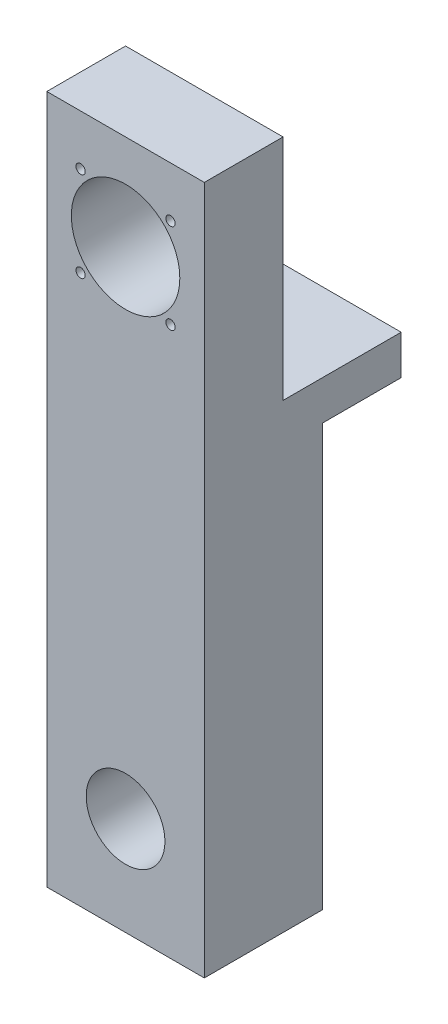
ISO-10303-21;
HEADER;
FILE_DESCRIPTION(('STEP AP214'),'2;1');
FILE_NAME('part.step','',(''),(''),'','','');
FILE_SCHEMA(('AUTOMOTIVE_DESIGN { 1 0 10303 214 1 1 1 1 }'));
ENDSEC;
DATA;
#1=APPLICATION_CONTEXT('core data for automotive mechanical design processes');
#2=APPLICATION_PROTOCOL_DEFINITION('international standard','automotive_design',2000,#1);
#3=PRODUCT_CONTEXT('',#1,'mechanical');
#4=PRODUCT('Part','Part','',(#3));
#5=PRODUCT_RELATED_PRODUCT_CATEGORY('part','',(#4));
#6=PRODUCT_DEFINITION_FORMATION('','',#4);
#7=PRODUCT_DEFINITION_CONTEXT('part definition',#1,'design');
#8=PRODUCT_DEFINITION('design','',#6,#7);
#9=PRODUCT_DEFINITION_SHAPE('','',#8);
#10=(LENGTH_UNIT() NAMED_UNIT(*) SI_UNIT(.MILLI.,.METRE.));
#11=(NAMED_UNIT(*) PLANE_ANGLE_UNIT() SI_UNIT($,.RADIAN.));
#12=(NAMED_UNIT(*) SI_UNIT($,.STERADIAN.) SOLID_ANGLE_UNIT());
#13=UNCERTAINTY_MEASURE_WITH_UNIT(LENGTH_MEASURE(1.E-05),#10,'distance_accuracy_value','');
#14=(GEOMETRIC_REPRESENTATION_CONTEXT(3) GLOBAL_UNCERTAINTY_ASSIGNED_CONTEXT((#13)) GLOBAL_UNIT_ASSIGNED_CONTEXT((#10,
#11,#12)) REPRESENTATION_CONTEXT('',''));
#15=CARTESIAN_POINT('',(0.,0.,0.));
#16=DIRECTION('',(0.,0.,1.));
#17=DIRECTION('',(1.,0.,0.));
#18=AXIS2_PLACEMENT_3D('',#15,#16,#17);
#19=CARTESIAN_POINT('',(25.4,222.25,19.05));
#20=DIRECTION('',(-1.,0.,0.));
#21=DIRECTION('',(0.,0.,1.));
#22=AXIS2_PLACEMENT_3D('',#19,#20,#21);
#23=PLANE('',#22);
#24=DIRECTION('',(0.,-1.,0.));
#25=VECTOR('',#24,1.);
#26=CARTESIAN_POINT('',(25.4,148.650670059,-44.45));
#27=LINE('',#26,#25);
#28=CARTESIAN_POINT('',(25.4,148.650670059,-44.45));
#29=VERTEX_POINT('',#28);
#30=CARTESIAN_POINT('',(25.4,135.950670059,-44.45));
#31=VERTEX_POINT('',#30);
#32=EDGE_CURVE('E99',#29,#31,#27,.T.);
#33=ORIENTED_EDGE('',*,*,#32,.F.);
#34=DIRECTION('',(0.,0.,1.));
#35=VECTOR('',#34,1.);
#36=CARTESIAN_POINT('',(25.4,148.650670059,-57.15));
#37=LINE('',#36,#35);
#38=CARTESIAN_POINT('',(25.4,148.650670059,-6.35));
#39=VERTEX_POINT('',#38);
#40=EDGE_CURVE('E210',#29,#39,#37,.T.);
#41=ORIENTED_EDGE('',*,*,#40,.T.);
#42=DIRECTION('',(0.,-1.,0.));
#43=VECTOR('',#42,1.);
#44=CARTESIAN_POINT('',(25.4,222.25,-6.35));
#45=LINE('',#44,#43);
#46=CARTESIAN_POINT('',(25.4,222.25,-6.35));
#47=VERTEX_POINT('',#46);
#48=EDGE_CURVE('E167',#47,#39,#45,.T.);
#49=ORIENTED_EDGE('',*,*,#48,.F.);
#50=DIRECTION('',(0.,0.,-1.));
#51=VECTOR('',#50,1.);
#52=CARTESIAN_POINT('',(25.4,222.25,19.05));
#53=LINE('',#52,#51);
#54=CARTESIAN_POINT('',(25.4,222.25,19.05));
#55=VERTEX_POINT('',#54);
#56=EDGE_CURVE('E127',#55,#47,#53,.T.);
#57=ORIENTED_EDGE('',*,*,#56,.F.);
#58=DIRECTION('',(0.,-1.,0.));
#59=VECTOR('',#58,1.);
#60=CARTESIAN_POINT('',(25.4,222.25,19.05));
#61=LINE('',#60,#59);
#62=CARTESIAN_POINT('',(25.4,0.,19.05));
#63=VERTEX_POINT('',#62);
#64=EDGE_CURVE('E135',#55,#63,#61,.T.);
#65=ORIENTED_EDGE('',*,*,#64,.T.);
#66=DIRECTION('',(0.,0.,-1.));
#67=VECTOR('',#66,1.);
#68=CARTESIAN_POINT('',(25.4,0.,19.05));
#69=LINE('',#68,#67);
#70=CARTESIAN_POINT('',(25.4,0.,-19.05));
#71=VERTEX_POINT('',#70);
#72=EDGE_CURVE('E124',#63,#71,#69,.T.);
#73=ORIENTED_EDGE('',*,*,#72,.T.);
#74=DIRECTION('',(0.,-1.,0.));
#75=VECTOR('',#74,1.);
#76=CARTESIAN_POINT('',(25.4,222.25,-19.05));
#77=LINE('',#76,#75);
#78=CARTESIAN_POINT('',(25.4,135.950670059,-19.05));
#79=VERTEX_POINT('',#78);
#80=EDGE_CURVE('E11',#79,#71,#77,.T.);
#81=ORIENTED_EDGE('',*,*,#80,.F.);
#82=DIRECTION('',(0.,0.,1.));
#83=VECTOR('',#82,1.);
#84=CARTESIAN_POINT('',(25.4,135.950670059,-57.15));
#85=LINE('',#84,#83);
#86=EDGE_CURVE('E58',#31,#79,#85,.T.);
#87=ORIENTED_EDGE('',*,*,#86,.F.);
#88=EDGE_LOOP('',(#33,#41,#49,#57,#65,#73,#81,#87));
#89=FACE_BOUND('',#88,.T.);
#90=ADVANCED_FACE('F35',(#89),#23,.F.);
#91=CARTESIAN_POINT('',(-25.4,222.25,19.05));
#92=DIRECTION('',(1.,0.,0.));
#93=DIRECTION('',(0.,0.,-1.));
#94=AXIS2_PLACEMENT_3D('',#91,#92,#93);
#95=PLANE('',#94);
#96=DIRECTION('',(0.,1.,0.));
#97=VECTOR('',#96,1.);
#98=CARTESIAN_POINT('',(-25.4,148.650670059,-44.45));
#99=LINE('',#98,#97);
#100=CARTESIAN_POINT('',(-25.4,135.950670059,-44.45));
#101=VERTEX_POINT('',#100);
#102=CARTESIAN_POINT('',(-25.4,148.650670059,-44.45));
#103=VERTEX_POINT('',#102);
#104=EDGE_CURVE('E50',#101,#103,#99,.T.);
#105=ORIENTED_EDGE('',*,*,#104,.F.);
#106=DIRECTION('',(0.,0.,1.));
#107=VECTOR('',#106,1.);
#108=CARTESIAN_POINT('',(-25.4,135.950670059,-57.15));
#109=LINE('',#108,#107);
#110=CARTESIAN_POINT('',(-25.4,135.950670059,-19.05));
#111=VERTEX_POINT('',#110);
#112=EDGE_CURVE('E108',#101,#111,#109,.T.);
#113=ORIENTED_EDGE('',*,*,#112,.T.);
#114=DIRECTION('',(0.,-1.,0.));
#115=VECTOR('',#114,1.);
#116=CARTESIAN_POINT('',(-25.4,222.25,-19.05));
#117=LINE('',#116,#115);
#118=CARTESIAN_POINT('',(-25.4,0.,-19.05));
#119=VERTEX_POINT('',#118);
#120=EDGE_CURVE('E43',#111,#119,#117,.T.);
#121=ORIENTED_EDGE('',*,*,#120,.T.);
#122=DIRECTION('',(0.,0.,1.));
#123=VECTOR('',#122,1.);
#124=CARTESIAN_POINT('',(-25.4,0.,19.05));
#125=LINE('',#124,#123);
#126=CARTESIAN_POINT('',(-25.4,0.,19.05));
#127=VERTEX_POINT('',#126);
#128=EDGE_CURVE('E140',#119,#127,#125,.T.);
#129=ORIENTED_EDGE('',*,*,#128,.T.);
#130=DIRECTION('',(0.,-1.,0.));
#131=VECTOR('',#130,1.);
#132=CARTESIAN_POINT('',(-25.4,222.25,19.05));
#133=LINE('',#132,#131);
#134=CARTESIAN_POINT('',(-25.4,222.25,19.05));
#135=VERTEX_POINT('',#134);
#136=EDGE_CURVE('E145',#135,#127,#133,.T.);
#137=ORIENTED_EDGE('',*,*,#136,.F.);
#138=DIRECTION('',(0.,0.,1.));
#139=VECTOR('',#138,1.);
#140=CARTESIAN_POINT('',(-25.4,222.25,19.05));
#141=LINE('',#140,#139);
#142=CARTESIAN_POINT('',(-25.4,222.25,-6.35));
#143=VERTEX_POINT('',#142);
#144=EDGE_CURVE('E130',#143,#135,#141,.T.);
#145=ORIENTED_EDGE('',*,*,#144,.F.);
#146=DIRECTION('',(0.,1.,0.));
#147=VECTOR('',#146,1.);
#148=CARTESIAN_POINT('',(-25.4,222.25,-6.35));
#149=LINE('',#148,#147);
#150=CARTESIAN_POINT('',(-25.4,148.650670059,-6.35));
#151=VERTEX_POINT('',#150);
#152=EDGE_CURVE('E175',#151,#143,#149,.T.);
#153=ORIENTED_EDGE('',*,*,#152,.F.);
#154=DIRECTION('',(0.,0.,1.));
#155=VECTOR('',#154,1.);
#156=CARTESIAN_POINT('',(-25.4,148.650670059,-57.15));
#157=LINE('',#156,#155);
#158=EDGE_CURVE('E117',#103,#151,#157,.T.);
#159=ORIENTED_EDGE('',*,*,#158,.F.);
#160=EDGE_LOOP('',(#105,#113,#121,#129,#137,#145,#153,#159));
#161=FACE_BOUND('',#160,.T.);
#162=ADVANCED_FACE('F150',(#161),#95,.F.);
#163=CARTESIAN_POINT('',(25.4,135.950670059,-57.15));
#164=DIRECTION('',(0.,1.,0.));
#165=DIRECTION('',(0.,0.,1.));
#166=AXIS2_PLACEMENT_3D('',#163,#164,#165);
#167=PLANE('',#166);
#168=DIRECTION('',(-1.,0.,0.));
#169=VECTOR('',#168,1.);
#170=CARTESIAN_POINT('',(25.4,135.950670059,-44.45));
#171=LINE('',#170,#169);
#172=EDGE_CURVE('E101',#31,#101,#171,.T.);
#173=ORIENTED_EDGE('',*,*,#172,.F.);
#174=ORIENTED_EDGE('',*,*,#86,.T.);
#175=DIRECTION('',(-1.,0.,0.));
#176=VECTOR('',#175,1.);
#177=CARTESIAN_POINT('',(25.4,135.950670059,-19.05));
#178=LINE('',#177,#176);
#179=EDGE_CURVE('E208',#79,#111,#178,.T.);
#180=ORIENTED_EDGE('',*,*,#179,.T.);
#181=ORIENTED_EDGE('',*,*,#112,.F.);
#182=EDGE_LOOP('',(#173,#174,#180,#181));
#183=FACE_BOUND('',#182,.T.);
#184=ADVANCED_FACE('F107',(#183),#167,.F.);
#185=CARTESIAN_POINT('',(25.4,148.650670059,-57.15));
#186=DIRECTION('',(0.,-1.,0.));
#187=DIRECTION('',(0.,0.,-1.));
#188=AXIS2_PLACEMENT_3D('',#185,#186,#187);
#189=PLANE('',#188);
#190=DIRECTION('',(1.,0.,0.));
#191=VECTOR('',#190,1.);
#192=CARTESIAN_POINT('',(25.4,148.650670059,-44.45));
#193=LINE('',#192,#191);
#194=EDGE_CURVE('E102',#103,#29,#193,.T.);
#195=ORIENTED_EDGE('',*,*,#194,.F.);
#196=ORIENTED_EDGE('',*,*,#158,.T.);
#197=DIRECTION('',(-1.,0.,0.));
#198=VECTOR('',#197,1.);
#199=CARTESIAN_POINT('',(25.4,148.650670059,-6.35));
#200=LINE('',#199,#198);
#201=EDGE_CURVE('E178',#39,#151,#200,.T.);
#202=ORIENTED_EDGE('',*,*,#201,.F.);
#203=ORIENTED_EDGE('',*,*,#40,.F.);
#204=EDGE_LOOP('',(#195,#196,#202,#203));
#205=FACE_BOUND('',#204,.T.);
#206=ADVANCED_FACE('F213',(#205),#189,.F.);
#207=CARTESIAN_POINT('',(0.,222.25,0.));
#208=DIRECTION('',(0.,-1.,0.));
#209=DIRECTION('',(0.,0.,-1.));
#210=AXIS2_PLACEMENT_3D('',#207,#208,#209);
#211=PLANE('',#210);
#212=DIRECTION('',(1.,0.,0.));
#213=VECTOR('',#212,1.);
#214=CARTESIAN_POINT('',(25.4,222.25,-6.35));
#215=LINE('',#214,#213);
#216=EDGE_CURVE('E171',#143,#47,#215,.T.);
#217=ORIENTED_EDGE('',*,*,#216,.F.);
#218=ORIENTED_EDGE('',*,*,#144,.T.);
#219=DIRECTION('',(1.,0.,0.));
#220=VECTOR('',#219,1.);
#221=CARTESIAN_POINT('',(-25.4,222.25,19.05));
#222=LINE('',#221,#220);
#223=EDGE_CURVE('E133',#135,#55,#222,.T.);
#224=ORIENTED_EDGE('',*,*,#223,.T.);
#225=ORIENTED_EDGE('',*,*,#56,.T.);
#226=EDGE_LOOP('',(#217,#218,#224,#225));
#227=FACE_BOUND('',#226,.T.);
#228=ADVANCED_FACE('F170',(#227),#211,.F.);
#229=CARTESIAN_POINT('',(0.,191.550000059,-19.05));
#230=DIRECTION('',(0.,0.,1.));
#231=DIRECTION('',(1.,0.,0.));
#232=AXIS2_PLACEMENT_3D('',#229,#230,#231);
#233=CYLINDRICAL_SURFACE('',#232,17.500000052);
#234=CARTESIAN_POINT('',(0.,191.550000059,19.05));
#235=DIRECTION('',(0.,0.,1.));
#236=DIRECTION('',(1.,0.,0.));
#237=AXIS2_PLACEMENT_3D('',#234,#235,#236);
#238=CIRCLE('',#237,17.500000052);
#239=CARTESIAN_POINT('',(17.500000052,191.550000059,19.05));
#240=VERTEX_POINT('',#239);
#241=EDGE_CURVE('E112',#240,#240,#238,.T.);
#242=CARTESIAN_POINT('',(0.,191.550000059,-6.35));
#243=DIRECTION('',(0.,0.,-1.));
#244=DIRECTION('',(-1.,0.,0.));
#245=AXIS2_PLACEMENT_3D('',#242,#243,#244);
#246=CIRCLE('',#245,17.500000052);
#247=CARTESIAN_POINT('',(17.500000052,191.550000059,-6.35));
#248=VERTEX_POINT('',#247);
#249=EDGE_CURVE('E193',#248,#248,#246,.F.);
#250=CARTESIAN_POINT('',(17.500000052,191.550000059,19.05));
#251=CARTESIAN_POINT('',(17.500000052,191.550000059,18.7854166666667));
#252=CARTESIAN_POINT('',(17.500000052,191.550000059,18.5208333333333));
#253=CARTESIAN_POINT('',(17.500000052,191.550000059,17.9916666666667));
#254=CARTESIAN_POINT('',(17.500000052,191.550000059,17.7270833333333));
#255=CARTESIAN_POINT('',(17.500000052,191.550000059,17.1979166666667));
#256=CARTESIAN_POINT('',(17.500000052,191.550000059,16.9333333333333));
#257=CARTESIAN_POINT('',(17.500000052,191.550000059,16.4041666666667));
#258=CARTESIAN_POINT('',(17.500000052,191.550000059,16.1395833333333));
#259=CARTESIAN_POINT('',(17.500000052,191.550000059,15.6104166666667));
#260=CARTESIAN_POINT('',(17.500000052,191.550000059,15.3458333333333));
#261=CARTESIAN_POINT('',(17.500000052,191.550000059,14.8166666666667));
#262=CARTESIAN_POINT('',(17.500000052,191.550000059,14.5520833333333));
#263=CARTESIAN_POINT('',(17.500000052,191.550000059,14.0229166666667));
#264=CARTESIAN_POINT('',(17.500000052,191.550000059,13.7583333333333));
#265=CARTESIAN_POINT('',(17.500000052,191.550000059,13.2291666666667));
#266=CARTESIAN_POINT('',(17.500000052,191.550000059,12.9645833333333));
#267=CARTESIAN_POINT('',(17.500000052,191.550000059,12.4354166666667));
#268=CARTESIAN_POINT('',(17.500000052,191.550000059,12.1708333333333));
#269=CARTESIAN_POINT('',(17.500000052,191.550000059,11.6416666666667));
#270=CARTESIAN_POINT('',(17.500000052,191.550000059,11.3770833333333));
#271=CARTESIAN_POINT('',(17.500000052,191.550000059,10.8479166666667));
#272=CARTESIAN_POINT('',(17.500000052,191.550000059,10.5833333333333));
#273=CARTESIAN_POINT('',(17.500000052,191.550000059,10.0541666666667));
#274=CARTESIAN_POINT('',(17.500000052,191.550000059,9.78958333333334));
#275=CARTESIAN_POINT('',(17.500000052,191.550000059,9.26041666666667));
#276=CARTESIAN_POINT('',(17.500000052,191.550000059,8.99583333333334));
#277=CARTESIAN_POINT('',(17.500000052,191.550000059,8.46666666666667));
#278=CARTESIAN_POINT('',(17.500000052,191.550000059,8.20208333333334));
#279=CARTESIAN_POINT('',(17.500000052,191.550000059,7.67291666666667));
#280=CARTESIAN_POINT('',(17.500000052,191.550000059,7.40833333333334));
#281=CARTESIAN_POINT('',(17.500000052,191.550000059,6.87916666666667));
#282=CARTESIAN_POINT('',(17.500000052,191.550000059,6.61458333333334));
#283=CARTESIAN_POINT('',(17.500000052,191.550000059,6.08541666666667));
#284=CARTESIAN_POINT('',(17.500000052,191.550000059,5.82083333333334));
#285=CARTESIAN_POINT('',(17.500000052,191.550000059,5.29166666666667));
#286=CARTESIAN_POINT('',(17.500000052,191.550000059,5.02708333333334));
#287=CARTESIAN_POINT('',(17.500000052,191.550000059,4.49791666666667));
#288=CARTESIAN_POINT('',(17.500000052,191.550000059,4.23333333333334));
#289=CARTESIAN_POINT('',(17.500000052,191.550000059,3.70416666666667));
#290=CARTESIAN_POINT('',(17.500000052,191.550000059,3.43958333333334));
#291=CARTESIAN_POINT('',(17.500000052,191.550000059,2.91041666666667));
#292=CARTESIAN_POINT('',(17.500000052,191.550000059,2.64583333333334));
#293=CARTESIAN_POINT('',(17.500000052,191.550000059,2.11666666666667));
#294=CARTESIAN_POINT('',(17.500000052,191.550000059,1.85208333333334));
#295=CARTESIAN_POINT('',(17.500000052,191.550000059,1.32291666666667));
#296=CARTESIAN_POINT('',(17.500000052,191.550000059,1.05833333333334));
#297=CARTESIAN_POINT('',(17.500000052,191.550000059,0.52916666666667));
#298=CARTESIAN_POINT('',(17.500000052,191.550000059,0.264583333333337));
#299=CARTESIAN_POINT('',(17.500000052,191.550000059,-0.26458333333333));
#300=CARTESIAN_POINT('',(17.500000052,191.550000059,-0.529166666666663));
#301=CARTESIAN_POINT('',(17.500000052,191.550000059,-1.05833333333333));
#302=CARTESIAN_POINT('',(17.500000052,191.550000059,-1.32291666666666));
#303=CARTESIAN_POINT('',(17.500000052,191.550000059,-1.85208333333333));
#304=CARTESIAN_POINT('',(17.500000052,191.550000059,-2.11666666666666));
#305=CARTESIAN_POINT('',(17.500000052,191.550000059,-2.64583333333333));
#306=CARTESIAN_POINT('',(17.500000052,191.550000059,-2.91041666666666));
#307=CARTESIAN_POINT('',(17.500000052,191.550000059,-3.43958333333333));
#308=CARTESIAN_POINT('',(17.500000052,191.550000059,-3.70416666666666));
#309=CARTESIAN_POINT('',(17.500000052,191.550000059,-4.23333333333333));
#310=CARTESIAN_POINT('',(17.500000052,191.550000059,-4.49791666666666));
#311=CARTESIAN_POINT('',(17.500000052,191.550000059,-5.02708333333333));
#312=CARTESIAN_POINT('',(17.500000052,191.550000059,-5.29166666666666));
#313=CARTESIAN_POINT('',(17.500000052,191.550000059,-5.82083333333333));
#314=CARTESIAN_POINT('',(17.500000052,191.550000059,-6.08541666666666));
#315=CARTESIAN_POINT('',(17.500000052,191.550000059,-6.35));
#316=B_SPLINE_CURVE_WITH_KNOTS('',3,(#250,#251,#252,#253,#254,#255,#256,#257,#258,#259,#260,
#261,#262,#263,#264,#265,#266,#267,#268,#269,#270,#271,#272,#273,#274,#275,#276,#277,#278,#279,
#280,#281,#282,#283,#284,#285,#286,#287,#288,#289,#290,#291,#292,#293,#294,#295,#296,#297,#298,
#299,#300,#301,#302,#303,#304,#305,#306,#307,#308,#309,#310,#311,#312,#313,#314,#315),
.UNSPECIFIED.,.F.,.F.,(4,2,2,2,2,2,2,2,2,2,2,2,2,2,2,2,2,2,2,2,2,2,2,2,2,2,2,2,2,2,2,2,4),(0.,
0.793750000000003,1.5875,2.38125,3.175,3.96875,4.7625,5.55625,6.35,7.14375,7.9375,8.73125,9.525,
10.31875,11.1125,11.90625,12.7,13.49375,14.2875,15.08125,15.875,16.66875,17.4625,18.25625,19.05,
19.84375,20.6375,21.43125,22.225,23.01875,23.8125,24.60625,25.4),.UNSPECIFIED.);
#317=EDGE_CURVE('BSEAM232',#240,#248,#316,.T.);
#318=ORIENTED_EDGE('',*,*,#241,.T.);
#319=ORIENTED_EDGE('',*,*,#249,.F.);
#320=ORIENTED_EDGE('',*,*,#317,.T.);
#321=ORIENTED_EDGE('',*,*,#317,.F.);
#322=EDGE_LOOP('',(#318,#320,#319,#321));
#323=FACE_BOUND('',#322,.T.);
#324=ADVANCED_FACE('F232',(#323),#233,.F.);
#325=CARTESIAN_POINT('',(-14.5034,206.053400059,19.05));
#326=DIRECTION('',(0.,0.,-1.));
#327=DIRECTION('',(-1.,0.,0.));
#328=AXIS2_PLACEMENT_3D('',#325,#326,#327);
#329=CYLINDRICAL_SURFACE('',#328,1.500000048);
#330=CARTESIAN_POINT('',(-14.5034,206.053400059,19.05));
#331=DIRECTION('',(0.,0.,-1.));
#332=DIRECTION('',(-1.,0.,0.));
#333=AXIS2_PLACEMENT_3D('',#330,#331,#332);
#334=CIRCLE('',#333,1.500000048);
#335=CARTESIAN_POINT('',(-16.003400048,206.053400059,19.05));
#336=VERTEX_POINT('',#335);
#337=EDGE_CURVE('E200',#336,#336,#334,.T.);
#338=CARTESIAN_POINT('',(-14.5034,206.053400059,-6.35));
#339=DIRECTION('',(0.,0.,-1.));
#340=DIRECTION('',(-1.,0.,0.));
#341=AXIS2_PLACEMENT_3D('',#338,#339,#340);
#342=CIRCLE('',#341,1.500000048);
#343=CARTESIAN_POINT('',(-16.003400048,206.053400059,-6.35));
#344=VERTEX_POINT('',#343);
#345=EDGE_CURVE('E190',#344,#344,#342,.F.);
#346=CARTESIAN_POINT('',(-16.003400048,206.053400059,19.05));
#347=CARTESIAN_POINT('',(-16.003400048,206.053400059,18.7854166666667));
#348=CARTESIAN_POINT('',(-16.003400048,206.053400059,18.5208333333333));
#349=CARTESIAN_POINT('',(-16.003400048,206.053400059,17.9916666666667));
#350=CARTESIAN_POINT('',(-16.003400048,206.053400059,17.7270833333333));
#351=CARTESIAN_POINT('',(-16.003400048,206.053400059,17.1979166666667));
#352=CARTESIAN_POINT('',(-16.003400048,206.053400059,16.9333333333333));
#353=CARTESIAN_POINT('',(-16.003400048,206.053400059,16.4041666666667));
#354=CARTESIAN_POINT('',(-16.003400048,206.053400059,16.1395833333333));
#355=CARTESIAN_POINT('',(-16.003400048,206.053400059,15.6104166666667));
#356=CARTESIAN_POINT('',(-16.003400048,206.053400059,15.3458333333333));
#357=CARTESIAN_POINT('',(-16.003400048,206.053400059,14.8166666666667));
#358=CARTESIAN_POINT('',(-16.003400048,206.053400059,14.5520833333333));
#359=CARTESIAN_POINT('',(-16.003400048,206.053400059,14.0229166666667));
#360=CARTESIAN_POINT('',(-16.003400048,206.053400059,13.7583333333333));
#361=CARTESIAN_POINT('',(-16.003400048,206.053400059,13.2291666666667));
#362=CARTESIAN_POINT('',(-16.003400048,206.053400059,12.9645833333333));
#363=CARTESIAN_POINT('',(-16.003400048,206.053400059,12.4354166666667));
#364=CARTESIAN_POINT('',(-16.003400048,206.053400059,12.1708333333333));
#365=CARTESIAN_POINT('',(-16.003400048,206.053400059,11.6416666666667));
#366=CARTESIAN_POINT('',(-16.003400048,206.053400059,11.3770833333333));
#367=CARTESIAN_POINT('',(-16.003400048,206.053400059,10.8479166666667));
#368=CARTESIAN_POINT('',(-16.003400048,206.053400059,10.5833333333333));
#369=CARTESIAN_POINT('',(-16.003400048,206.053400059,10.0541666666667));
#370=CARTESIAN_POINT('',(-16.003400048,206.053400059,9.78958333333334));
#371=CARTESIAN_POINT('',(-16.003400048,206.053400059,9.26041666666667));
#372=CARTESIAN_POINT('',(-16.003400048,206.053400059,8.99583333333334));
#373=CARTESIAN_POINT('',(-16.003400048,206.053400059,8.46666666666667));
#374=CARTESIAN_POINT('',(-16.003400048,206.053400059,8.20208333333334));
#375=CARTESIAN_POINT('',(-16.003400048,206.053400059,7.67291666666667));
#376=CARTESIAN_POINT('',(-16.003400048,206.053400059,7.40833333333334));
#377=CARTESIAN_POINT('',(-16.003400048,206.053400059,6.87916666666667));
#378=CARTESIAN_POINT('',(-16.003400048,206.053400059,6.61458333333334));
#379=CARTESIAN_POINT('',(-16.003400048,206.053400059,6.08541666666667));
#380=CARTESIAN_POINT('',(-16.003400048,206.053400059,5.82083333333334));
#381=CARTESIAN_POINT('',(-16.003400048,206.053400059,5.29166666666667));
#382=CARTESIAN_POINT('',(-16.003400048,206.053400059,5.02708333333334));
#383=CARTESIAN_POINT('',(-16.003400048,206.053400059,4.49791666666667));
#384=CARTESIAN_POINT('',(-16.003400048,206.053400059,4.23333333333334));
#385=CARTESIAN_POINT('',(-16.003400048,206.053400059,3.70416666666667));
#386=CARTESIAN_POINT('',(-16.003400048,206.053400059,3.43958333333334));
#387=CARTESIAN_POINT('',(-16.003400048,206.053400059,2.91041666666667));
#388=CARTESIAN_POINT('',(-16.003400048,206.053400059,2.64583333333334));
#389=CARTESIAN_POINT('',(-16.003400048,206.053400059,2.11666666666667));
#390=CARTESIAN_POINT('',(-16.003400048,206.053400059,1.85208333333334));
#391=CARTESIAN_POINT('',(-16.003400048,206.053400059,1.32291666666667));
#392=CARTESIAN_POINT('',(-16.003400048,206.053400059,1.05833333333334));
#393=CARTESIAN_POINT('',(-16.003400048,206.053400059,0.52916666666667));
#394=CARTESIAN_POINT('',(-16.003400048,206.053400059,0.264583333333337));
#395=CARTESIAN_POINT('',(-16.003400048,206.053400059,-0.26458333333333));
#396=CARTESIAN_POINT('',(-16.003400048,206.053400059,-0.529166666666663));
#397=CARTESIAN_POINT('',(-16.003400048,206.053400059,-1.05833333333333));
#398=CARTESIAN_POINT('',(-16.003400048,206.053400059,-1.32291666666666));
#399=CARTESIAN_POINT('',(-16.003400048,206.053400059,-1.85208333333333));
#400=CARTESIAN_POINT('',(-16.003400048,206.053400059,-2.11666666666666));
#401=CARTESIAN_POINT('',(-16.003400048,206.053400059,-2.64583333333333));
#402=CARTESIAN_POINT('',(-16.003400048,206.053400059,-2.91041666666666));
#403=CARTESIAN_POINT('',(-16.003400048,206.053400059,-3.43958333333333));
#404=CARTESIAN_POINT('',(-16.003400048,206.053400059,-3.70416666666666));
#405=CARTESIAN_POINT('',(-16.003400048,206.053400059,-4.23333333333333));
#406=CARTESIAN_POINT('',(-16.003400048,206.053400059,-4.49791666666667));
#407=CARTESIAN_POINT('',(-16.003400048,206.053400059,-5.02708333333333));
#408=CARTESIAN_POINT('',(-16.003400048,206.053400059,-5.29166666666667));
#409=CARTESIAN_POINT('',(-16.003400048,206.053400059,-5.82083333333333));
#410=CARTESIAN_POINT('',(-16.003400048,206.053400059,-6.08541666666667));
#411=CARTESIAN_POINT('',(-16.003400048,206.053400059,-6.35));
#412=B_SPLINE_CURVE_WITH_KNOTS('',3,(#346,#347,#348,#349,#350,#351,#352,#353,#354,#355,#356,
#357,#358,#359,#360,#361,#362,#363,#364,#365,#366,#367,#368,#369,#370,#371,#372,#373,#374,#375,
#376,#377,#378,#379,#380,#381,#382,#383,#384,#385,#386,#387,#388,#389,#390,#391,#392,#393,#394,
#395,#396,#397,#398,#399,#400,#401,#402,#403,#404,#405,#406,#407,#408,#409,#410,#411),
.UNSPECIFIED.,.F.,.F.,(4,2,2,2,2,2,2,2,2,2,2,2,2,2,2,2,2,2,2,2,2,2,2,2,2,2,2,2,2,2,2,2,4),(0.,
0.793749999999999,1.5875,2.38125,3.175,3.96875,4.7625,5.55625,6.35,7.14375,7.9375,8.73125,9.525,
10.31875,11.1125,11.90625,12.7,13.49375,14.2875,15.08125,15.875,16.66875,17.4625,18.25625,19.05,
19.84375,20.6375,21.43125,22.225,23.01875,23.8125,24.60625,25.4),.UNSPECIFIED.);
#413=EDGE_CURVE('BSEAM234',#336,#344,#412,.T.);
#414=ORIENTED_EDGE('',*,*,#337,.F.);
#415=ORIENTED_EDGE('',*,*,#345,.F.);
#416=ORIENTED_EDGE('',*,*,#413,.T.);
#417=ORIENTED_EDGE('',*,*,#413,.F.);
#418=EDGE_LOOP('',(#414,#416,#415,#417));
#419=FACE_BOUND('',#418,.T.);
#420=ADVANCED_FACE('F234',(#419),#329,.F.);
#421=CARTESIAN_POINT('',(14.5034,206.053400059,19.05));
#422=DIRECTION('',(0.,0.,-1.));
#423=DIRECTION('',(-1.,0.,0.));
#424=AXIS2_PLACEMENT_3D('',#421,#422,#423);
#425=CYLINDRICAL_SURFACE('',#424,1.500000048);
#426=CARTESIAN_POINT('',(14.5034,206.053400059,19.05));
#427=DIRECTION('',(0.,0.,-1.));
#428=DIRECTION('',(-1.,0.,0.));
#429=AXIS2_PLACEMENT_3D('',#426,#427,#428);
#430=CIRCLE('',#429,1.500000048);
#431=CARTESIAN_POINT('',(13.003399952,206.053400059,19.05));
#432=VERTEX_POINT('',#431);
#433=EDGE_CURVE('E197',#432,#432,#430,.T.);
#434=CARTESIAN_POINT('',(14.5034,206.053400059,-6.35));
#435=DIRECTION('',(0.,0.,-1.));
#436=DIRECTION('',(-1.,0.,0.));
#437=AXIS2_PLACEMENT_3D('',#434,#435,#436);
#438=CIRCLE('',#437,1.500000048);
#439=CARTESIAN_POINT('',(13.003399952,206.053400059,-6.35));
#440=VERTEX_POINT('',#439);
#441=EDGE_CURVE('E187',#440,#440,#438,.F.);
#442=CARTESIAN_POINT('',(13.003399952,206.053400059,19.05));
#443=CARTESIAN_POINT('',(13.003399952,206.053400059,18.7854166666667));
#444=CARTESIAN_POINT('',(13.003399952,206.053400059,18.5208333333333));
#445=CARTESIAN_POINT('',(13.003399952,206.053400059,17.9916666666667));
#446=CARTESIAN_POINT('',(13.003399952,206.053400059,17.7270833333333));
#447=CARTESIAN_POINT('',(13.003399952,206.053400059,17.1979166666667));
#448=CARTESIAN_POINT('',(13.003399952,206.053400059,16.9333333333333));
#449=CARTESIAN_POINT('',(13.003399952,206.053400059,16.4041666666667));
#450=CARTESIAN_POINT('',(13.003399952,206.053400059,16.1395833333333));
#451=CARTESIAN_POINT('',(13.003399952,206.053400059,15.6104166666667));
#452=CARTESIAN_POINT('',(13.003399952,206.053400059,15.3458333333333));
#453=CARTESIAN_POINT('',(13.003399952,206.053400059,14.8166666666667));
#454=CARTESIAN_POINT('',(13.003399952,206.053400059,14.5520833333333));
#455=CARTESIAN_POINT('',(13.003399952,206.053400059,14.0229166666667));
#456=CARTESIAN_POINT('',(13.003399952,206.053400059,13.7583333333333));
#457=CARTESIAN_POINT('',(13.003399952,206.053400059,13.2291666666667));
#458=CARTESIAN_POINT('',(13.003399952,206.053400059,12.9645833333333));
#459=CARTESIAN_POINT('',(13.003399952,206.053400059,12.4354166666667));
#460=CARTESIAN_POINT('',(13.003399952,206.053400059,12.1708333333333));
#461=CARTESIAN_POINT('',(13.003399952,206.053400059,11.6416666666667));
#462=CARTESIAN_POINT('',(13.003399952,206.053400059,11.3770833333333));
#463=CARTESIAN_POINT('',(13.003399952,206.053400059,10.8479166666667));
#464=CARTESIAN_POINT('',(13.003399952,206.053400059,10.5833333333333));
#465=CARTESIAN_POINT('',(13.003399952,206.053400059,10.0541666666667));
#466=CARTESIAN_POINT('',(13.003399952,206.053400059,9.78958333333334));
#467=CARTESIAN_POINT('',(13.003399952,206.053400059,9.26041666666667));
#468=CARTESIAN_POINT('',(13.003399952,206.053400059,8.99583333333334));
#469=CARTESIAN_POINT('',(13.003399952,206.053400059,8.46666666666667));
#470=CARTESIAN_POINT('',(13.003399952,206.053400059,8.20208333333334));
#471=CARTESIAN_POINT('',(13.003399952,206.053400059,7.67291666666667));
#472=CARTESIAN_POINT('',(13.003399952,206.053400059,7.40833333333334));
#473=CARTESIAN_POINT('',(13.003399952,206.053400059,6.87916666666667));
#474=CARTESIAN_POINT('',(13.003399952,206.053400059,6.61458333333334));
#475=CARTESIAN_POINT('',(13.003399952,206.053400059,6.08541666666667));
#476=CARTESIAN_POINT('',(13.003399952,206.053400059,5.82083333333334));
#477=CARTESIAN_POINT('',(13.003399952,206.053400059,5.29166666666667));
#478=CARTESIAN_POINT('',(13.003399952,206.053400059,5.02708333333334));
#479=CARTESIAN_POINT('',(13.003399952,206.053400059,4.49791666666667));
#480=CARTESIAN_POINT('',(13.003399952,206.053400059,4.23333333333334));
#481=CARTESIAN_POINT('',(13.003399952,206.053400059,3.70416666666667));
#482=CARTESIAN_POINT('',(13.003399952,206.053400059,3.43958333333334));
#483=CARTESIAN_POINT('',(13.003399952,206.053400059,2.91041666666667));
#484=CARTESIAN_POINT('',(13.003399952,206.053400059,2.64583333333334));
#485=CARTESIAN_POINT('',(13.003399952,206.053400059,2.11666666666667));
#486=CARTESIAN_POINT('',(13.003399952,206.053400059,1.85208333333334));
#487=CARTESIAN_POINT('',(13.003399952,206.053400059,1.32291666666667));
#488=CARTESIAN_POINT('',(13.003399952,206.053400059,1.05833333333334));
#489=CARTESIAN_POINT('',(13.003399952,206.053400059,0.52916666666667));
#490=CARTESIAN_POINT('',(13.003399952,206.053400059,0.264583333333337));
#491=CARTESIAN_POINT('',(13.003399952,206.053400059,-0.26458333333333));
#492=CARTESIAN_POINT('',(13.003399952,206.053400059,-0.529166666666663));
#493=CARTESIAN_POINT('',(13.003399952,206.053400059,-1.05833333333333));
#494=CARTESIAN_POINT('',(13.003399952,206.053400059,-1.32291666666666));
#495=CARTESIAN_POINT('',(13.003399952,206.053400059,-1.85208333333333));
#496=CARTESIAN_POINT('',(13.003399952,206.053400059,-2.11666666666666));
#497=CARTESIAN_POINT('',(13.003399952,206.053400059,-2.64583333333333));
#498=CARTESIAN_POINT('',(13.003399952,206.053400059,-2.91041666666666));
#499=CARTESIAN_POINT('',(13.003399952,206.053400059,-3.43958333333333));
#500=CARTESIAN_POINT('',(13.003399952,206.053400059,-3.70416666666666));
#501=CARTESIAN_POINT('',(13.003399952,206.053400059,-4.23333333333333));
#502=CARTESIAN_POINT('',(13.003399952,206.053400059,-4.49791666666667));
#503=CARTESIAN_POINT('',(13.003399952,206.053400059,-5.02708333333333));
#504=CARTESIAN_POINT('',(13.003399952,206.053400059,-5.29166666666667));
#505=CARTESIAN_POINT('',(13.003399952,206.053400059,-5.82083333333333));
#506=CARTESIAN_POINT('',(13.003399952,206.053400059,-6.08541666666667));
#507=CARTESIAN_POINT('',(13.003399952,206.053400059,-6.35));
#508=B_SPLINE_CURVE_WITH_KNOTS('',3,(#442,#443,#444,#445,#446,#447,#448,#449,#450,#451,#452,
#453,#454,#455,#456,#457,#458,#459,#460,#461,#462,#463,#464,#465,#466,#467,#468,#469,#470,#471,
#472,#473,#474,#475,#476,#477,#478,#479,#480,#481,#482,#483,#484,#485,#486,#487,#488,#489,#490,
#491,#492,#493,#494,#495,#496,#497,#498,#499,#500,#501,#502,#503,#504,#505,#506,#507),
.UNSPECIFIED.,.F.,.F.,(4,2,2,2,2,2,2,2,2,2,2,2,2,2,2,2,2,2,2,2,2,2,2,2,2,2,2,2,2,2,2,2,4),(0.,
0.793749999999999,1.5875,2.38125,3.175,3.96875,4.7625,5.55625,6.35,7.14375,7.9375,8.73125,9.525,
10.31875,11.1125,11.90625,12.7,13.49375,14.2875,15.08125,15.875,16.66875,17.4625,18.25625,19.05,
19.84375,20.6375,21.43125,22.225,23.01875,23.8125,24.60625,25.4),.UNSPECIFIED.);
#509=EDGE_CURVE('BSEAM241',#432,#440,#508,.T.);
#510=ORIENTED_EDGE('',*,*,#433,.F.);
#511=ORIENTED_EDGE('',*,*,#441,.F.);
#512=ORIENTED_EDGE('',*,*,#509,.T.);
#513=ORIENTED_EDGE('',*,*,#509,.F.);
#514=EDGE_LOOP('',(#510,#512,#511,#513));
#515=FACE_BOUND('',#514,.T.);
#516=ADVANCED_FACE('F241',(#515),#425,.F.);
#517=CARTESIAN_POINT('',(14.5034,177.046600059,19.05));
#518=DIRECTION('',(0.,0.,-1.));
#519=DIRECTION('',(-1.,0.,0.));
#520=AXIS2_PLACEMENT_3D('',#517,#518,#519);
#521=CYLINDRICAL_SURFACE('',#520,1.500000048);
#522=CARTESIAN_POINT('',(14.5034,177.046600059,19.05));
#523=DIRECTION('',(0.,0.,-1.));
#524=DIRECTION('',(-1.,0.,0.));
#525=AXIS2_PLACEMENT_3D('',#522,#523,#524);
#526=CIRCLE('',#525,1.500000048);
#527=CARTESIAN_POINT('',(13.003399952,177.046600059,19.05));
#528=VERTEX_POINT('',#527);
#529=EDGE_CURVE('E201',#528,#528,#526,.T.);
#530=CARTESIAN_POINT('',(14.5034,177.046600059,-6.35));
#531=DIRECTION('',(0.,0.,-1.));
#532=DIRECTION('',(-1.,0.,0.));
#533=AXIS2_PLACEMENT_3D('',#530,#531,#532);
#534=CIRCLE('',#533,1.500000048);
#535=CARTESIAN_POINT('',(13.003399952,177.046600059,-6.35));
#536=VERTEX_POINT('',#535);
#537=EDGE_CURVE('E184',#536,#536,#534,.F.);
#538=CARTESIAN_POINT('',(13.003399952,177.046600059,19.05));
#539=CARTESIAN_POINT('',(13.003399952,177.046600059,18.7854166666667));
#540=CARTESIAN_POINT('',(13.003399952,177.046600059,18.5208333333333));
#541=CARTESIAN_POINT('',(13.003399952,177.046600059,17.9916666666667));
#542=CARTESIAN_POINT('',(13.003399952,177.046600059,17.7270833333333));
#543=CARTESIAN_POINT('',(13.003399952,177.046600059,17.1979166666667));
#544=CARTESIAN_POINT('',(13.003399952,177.046600059,16.9333333333333));
#545=CARTESIAN_POINT('',(13.003399952,177.046600059,16.4041666666667));
#546=CARTESIAN_POINT('',(13.003399952,177.046600059,16.1395833333333));
#547=CARTESIAN_POINT('',(13.003399952,177.046600059,15.6104166666667));
#548=CARTESIAN_POINT('',(13.003399952,177.046600059,15.3458333333333));
#549=CARTESIAN_POINT('',(13.003399952,177.046600059,14.8166666666667));
#550=CARTESIAN_POINT('',(13.003399952,177.046600059,14.5520833333333));
#551=CARTESIAN_POINT('',(13.003399952,177.046600059,14.0229166666667));
#552=CARTESIAN_POINT('',(13.003399952,177.046600059,13.7583333333333));
#553=CARTESIAN_POINT('',(13.003399952,177.046600059,13.2291666666667));
#554=CARTESIAN_POINT('',(13.003399952,177.046600059,12.9645833333333));
#555=CARTESIAN_POINT('',(13.003399952,177.046600059,12.4354166666667));
#556=CARTESIAN_POINT('',(13.003399952,177.046600059,12.1708333333333));
#557=CARTESIAN_POINT('',(13.003399952,177.046600059,11.6416666666667));
#558=CARTESIAN_POINT('',(13.003399952,177.046600059,11.3770833333333));
#559=CARTESIAN_POINT('',(13.003399952,177.046600059,10.8479166666667));
#560=CARTESIAN_POINT('',(13.003399952,177.046600059,10.5833333333333));
#561=CARTESIAN_POINT('',(13.003399952,177.046600059,10.0541666666667));
#562=CARTESIAN_POINT('',(13.003399952,177.046600059,9.78958333333334));
#563=CARTESIAN_POINT('',(13.003399952,177.046600059,9.26041666666667));
#564=CARTESIAN_POINT('',(13.003399952,177.046600059,8.99583333333334));
#565=CARTESIAN_POINT('',(13.003399952,177.046600059,8.46666666666667));
#566=CARTESIAN_POINT('',(13.003399952,177.046600059,8.20208333333334));
#567=CARTESIAN_POINT('',(13.003399952,177.046600059,7.67291666666667));
#568=CARTESIAN_POINT('',(13.003399952,177.046600059,7.40833333333334));
#569=CARTESIAN_POINT('',(13.003399952,177.046600059,6.87916666666667));
#570=CARTESIAN_POINT('',(13.003399952,177.046600059,6.61458333333334));
#571=CARTESIAN_POINT('',(13.003399952,177.046600059,6.08541666666667));
#572=CARTESIAN_POINT('',(13.003399952,177.046600059,5.82083333333334));
#573=CARTESIAN_POINT('',(13.003399952,177.046600059,5.29166666666667));
#574=CARTESIAN_POINT('',(13.003399952,177.046600059,5.02708333333334));
#575=CARTESIAN_POINT('',(13.003399952,177.046600059,4.49791666666667));
#576=CARTESIAN_POINT('',(13.003399952,177.046600059,4.23333333333334));
#577=CARTESIAN_POINT('',(13.003399952,177.046600059,3.70416666666667));
#578=CARTESIAN_POINT('',(13.003399952,177.046600059,3.43958333333334));
#579=CARTESIAN_POINT('',(13.003399952,177.046600059,2.91041666666667));
#580=CARTESIAN_POINT('',(13.003399952,177.046600059,2.64583333333334));
#581=CARTESIAN_POINT('',(13.003399952,177.046600059,2.11666666666667));
#582=CARTESIAN_POINT('',(13.003399952,177.046600059,1.85208333333334));
#583=CARTESIAN_POINT('',(13.003399952,177.046600059,1.32291666666667));
#584=CARTESIAN_POINT('',(13.003399952,177.046600059,1.05833333333334));
#585=CARTESIAN_POINT('',(13.003399952,177.046600059,0.52916666666667));
#586=CARTESIAN_POINT('',(13.003399952,177.046600059,0.264583333333337));
#587=CARTESIAN_POINT('',(13.003399952,177.046600059,-0.26458333333333));
#588=CARTESIAN_POINT('',(13.003399952,177.046600059,-0.529166666666663));
#589=CARTESIAN_POINT('',(13.003399952,177.046600059,-1.05833333333333));
#590=CARTESIAN_POINT('',(13.003399952,177.046600059,-1.32291666666666));
#591=CARTESIAN_POINT('',(13.003399952,177.046600059,-1.85208333333333));
#592=CARTESIAN_POINT('',(13.003399952,177.046600059,-2.11666666666666));
#593=CARTESIAN_POINT('',(13.003399952,177.046600059,-2.64583333333333));
#594=CARTESIAN_POINT('',(13.003399952,177.046600059,-2.91041666666666));
#595=CARTESIAN_POINT('',(13.003399952,177.046600059,-3.43958333333333));
#596=CARTESIAN_POINT('',(13.003399952,177.046600059,-3.70416666666666));
#597=CARTESIAN_POINT('',(13.003399952,177.046600059,-4.23333333333333));
#598=CARTESIAN_POINT('',(13.003399952,177.046600059,-4.49791666666667));
#599=CARTESIAN_POINT('',(13.003399952,177.046600059,-5.02708333333333));
#600=CARTESIAN_POINT('',(13.003399952,177.046600059,-5.29166666666667));
#601=CARTESIAN_POINT('',(13.003399952,177.046600059,-5.82083333333333));
#602=CARTESIAN_POINT('',(13.003399952,177.046600059,-6.08541666666667));
#603=CARTESIAN_POINT('',(13.003399952,177.046600059,-6.35));
#604=B_SPLINE_CURVE_WITH_KNOTS('',3,(#538,#539,#540,#541,#542,#543,#544,#545,#546,#547,#548,
#549,#550,#551,#552,#553,#554,#555,#556,#557,#558,#559,#560,#561,#562,#563,#564,#565,#566,#567,
#568,#569,#570,#571,#572,#573,#574,#575,#576,#577,#578,#579,#580,#581,#582,#583,#584,#585,#586,
#587,#588,#589,#590,#591,#592,#593,#594,#595,#596,#597,#598,#599,#600,#601,#602,#603),
.UNSPECIFIED.,.F.,.F.,(4,2,2,2,2,2,2,2,2,2,2,2,2,2,2,2,2,2,2,2,2,2,2,2,2,2,2,2,2,2,2,2,4),(0.,
0.793749999999999,1.5875,2.38125,3.175,3.96875,4.7625,5.55625,6.35,7.14375,7.9375,8.73125,9.525,
10.31875,11.1125,11.90625,12.7,13.49375,14.2875,15.08125,15.875,16.66875,17.4625,18.25625,19.05,
19.84375,20.6375,21.43125,22.225,23.01875,23.8125,24.60625,25.4),.UNSPECIFIED.);
#605=EDGE_CURVE('BSEAM265',#528,#536,#604,.T.);
#606=ORIENTED_EDGE('',*,*,#529,.F.);
#607=ORIENTED_EDGE('',*,*,#537,.F.);
#608=ORIENTED_EDGE('',*,*,#605,.T.);
#609=ORIENTED_EDGE('',*,*,#605,.F.);
#610=EDGE_LOOP('',(#606,#608,#607,#609));
#611=FACE_BOUND('',#610,.T.);
#612=ADVANCED_FACE('F265',(#611),#521,.F.);
#613=CARTESIAN_POINT('',(-14.5034,177.046600059,19.05));
#614=DIRECTION('',(0.,0.,-1.));
#615=DIRECTION('',(-1.,0.,0.));
#616=AXIS2_PLACEMENT_3D('',#613,#614,#615);
#617=CYLINDRICAL_SURFACE('',#616,1.500000048);
#618=CARTESIAN_POINT('',(-14.5034,177.046600059,19.05));
#619=DIRECTION('',(0.,0.,-1.));
#620=DIRECTION('',(-1.,0.,0.));
#621=AXIS2_PLACEMENT_3D('',#618,#619,#620);
#622=CIRCLE('',#621,1.500000048);
#623=CARTESIAN_POINT('',(-16.003400048,177.046600059,19.05));
#624=VERTEX_POINT('',#623);
#625=EDGE_CURVE('E196',#624,#624,#622,.T.);
#626=CARTESIAN_POINT('',(-14.5034,177.046600059,-6.35));
#627=DIRECTION('',(0.,0.,-1.));
#628=DIRECTION('',(-1.,0.,0.));
#629=AXIS2_PLACEMENT_3D('',#626,#627,#628);
#630=CIRCLE('',#629,1.500000048);
#631=CARTESIAN_POINT('',(-16.003400048,177.046600059,-6.35));
#632=VERTEX_POINT('',#631);
#633=EDGE_CURVE('E38',#632,#632,#630,.F.);
#634=CARTESIAN_POINT('',(-16.003400048,177.046600059,19.05));
#635=CARTESIAN_POINT('',(-16.003400048,177.046600059,18.7854166666667));
#636=CARTESIAN_POINT('',(-16.003400048,177.046600059,18.5208333333333));
#637=CARTESIAN_POINT('',(-16.003400048,177.046600059,17.9916666666667));
#638=CARTESIAN_POINT('',(-16.003400048,177.046600059,17.7270833333333));
#639=CARTESIAN_POINT('',(-16.003400048,177.046600059,17.1979166666667));
#640=CARTESIAN_POINT('',(-16.003400048,177.046600059,16.9333333333333));
#641=CARTESIAN_POINT('',(-16.003400048,177.046600059,16.4041666666667));
#642=CARTESIAN_POINT('',(-16.003400048,177.046600059,16.1395833333333));
#643=CARTESIAN_POINT('',(-16.003400048,177.046600059,15.6104166666667));
#644=CARTESIAN_POINT('',(-16.003400048,177.046600059,15.3458333333333));
#645=CARTESIAN_POINT('',(-16.003400048,177.046600059,14.8166666666667));
#646=CARTESIAN_POINT('',(-16.003400048,177.046600059,14.5520833333333));
#647=CARTESIAN_POINT('',(-16.003400048,177.046600059,14.0229166666667));
#648=CARTESIAN_POINT('',(-16.003400048,177.046600059,13.7583333333333));
#649=CARTESIAN_POINT('',(-16.003400048,177.046600059,13.2291666666667));
#650=CARTESIAN_POINT('',(-16.003400048,177.046600059,12.9645833333333));
#651=CARTESIAN_POINT('',(-16.003400048,177.046600059,12.4354166666667));
#652=CARTESIAN_POINT('',(-16.003400048,177.046600059,12.1708333333333));
#653=CARTESIAN_POINT('',(-16.003400048,177.046600059,11.6416666666667));
#654=CARTESIAN_POINT('',(-16.003400048,177.046600059,11.3770833333333));
#655=CARTESIAN_POINT('',(-16.003400048,177.046600059,10.8479166666667));
#656=CARTESIAN_POINT('',(-16.003400048,177.046600059,10.5833333333333));
#657=CARTESIAN_POINT('',(-16.003400048,177.046600059,10.0541666666667));
#658=CARTESIAN_POINT('',(-16.003400048,177.046600059,9.78958333333334));
#659=CARTESIAN_POINT('',(-16.003400048,177.046600059,9.26041666666667));
#660=CARTESIAN_POINT('',(-16.003400048,177.046600059,8.99583333333334));
#661=CARTESIAN_POINT('',(-16.003400048,177.046600059,8.46666666666667));
#662=CARTESIAN_POINT('',(-16.003400048,177.046600059,8.20208333333334));
#663=CARTESIAN_POINT('',(-16.003400048,177.046600059,7.67291666666667));
#664=CARTESIAN_POINT('',(-16.003400048,177.046600059,7.40833333333334));
#665=CARTESIAN_POINT('',(-16.003400048,177.046600059,6.87916666666667));
#666=CARTESIAN_POINT('',(-16.003400048,177.046600059,6.61458333333334));
#667=CARTESIAN_POINT('',(-16.003400048,177.046600059,6.08541666666667));
#668=CARTESIAN_POINT('',(-16.003400048,177.046600059,5.82083333333334));
#669=CARTESIAN_POINT('',(-16.003400048,177.046600059,5.29166666666667));
#670=CARTESIAN_POINT('',(-16.003400048,177.046600059,5.02708333333334));
#671=CARTESIAN_POINT('',(-16.003400048,177.046600059,4.49791666666667));
#672=CARTESIAN_POINT('',(-16.003400048,177.046600059,4.23333333333334));
#673=CARTESIAN_POINT('',(-16.003400048,177.046600059,3.70416666666667));
#674=CARTESIAN_POINT('',(-16.003400048,177.046600059,3.43958333333334));
#675=CARTESIAN_POINT('',(-16.003400048,177.046600059,2.91041666666667));
#676=CARTESIAN_POINT('',(-16.003400048,177.046600059,2.64583333333334));
#677=CARTESIAN_POINT('',(-16.003400048,177.046600059,2.11666666666667));
#678=CARTESIAN_POINT('',(-16.003400048,177.046600059,1.85208333333334));
#679=CARTESIAN_POINT('',(-16.003400048,177.046600059,1.32291666666667));
#680=CARTESIAN_POINT('',(-16.003400048,177.046600059,1.05833333333334));
#681=CARTESIAN_POINT('',(-16.003400048,177.046600059,0.52916666666667));
#682=CARTESIAN_POINT('',(-16.003400048,177.046600059,0.264583333333337));
#683=CARTESIAN_POINT('',(-16.003400048,177.046600059,-0.26458333333333));
#684=CARTESIAN_POINT('',(-16.003400048,177.046600059,-0.529166666666663));
#685=CARTESIAN_POINT('',(-16.003400048,177.046600059,-1.05833333333333));
#686=CARTESIAN_POINT('',(-16.003400048,177.046600059,-1.32291666666666));
#687=CARTESIAN_POINT('',(-16.003400048,177.046600059,-1.85208333333333));
#688=CARTESIAN_POINT('',(-16.003400048,177.046600059,-2.11666666666666));
#689=CARTESIAN_POINT('',(-16.003400048,177.046600059,-2.64583333333333));
#690=CARTESIAN_POINT('',(-16.003400048,177.046600059,-2.91041666666666));
#691=CARTESIAN_POINT('',(-16.003400048,177.046600059,-3.43958333333333));
#692=CARTESIAN_POINT('',(-16.003400048,177.046600059,-3.70416666666666));
#693=CARTESIAN_POINT('',(-16.003400048,177.046600059,-4.23333333333333));
#694=CARTESIAN_POINT('',(-16.003400048,177.046600059,-4.49791666666667));
#695=CARTESIAN_POINT('',(-16.003400048,177.046600059,-5.02708333333333));
#696=CARTESIAN_POINT('',(-16.003400048,177.046600059,-5.29166666666667));
#697=CARTESIAN_POINT('',(-16.003400048,177.046600059,-5.82083333333333));
#698=CARTESIAN_POINT('',(-16.003400048,177.046600059,-6.08541666666667));
#699=CARTESIAN_POINT('',(-16.003400048,177.046600059,-6.35));
#700=B_SPLINE_CURVE_WITH_KNOTS('',3,(#634,#635,#636,#637,#638,#639,#640,#641,#642,#643,#644,
#645,#646,#647,#648,#649,#650,#651,#652,#653,#654,#655,#656,#657,#658,#659,#660,#661,#662,#663,
#664,#665,#666,#667,#668,#669,#670,#671,#672,#673,#674,#675,#676,#677,#678,#679,#680,#681,#682,
#683,#684,#685,#686,#687,#688,#689,#690,#691,#692,#693,#694,#695,#696,#697,#698,#699),
.UNSPECIFIED.,.F.,.F.,(4,2,2,2,2,2,2,2,2,2,2,2,2,2,2,2,2,2,2,2,2,2,2,2,2,2,2,2,2,2,2,2,4),(0.,
0.793749999999999,1.5875,2.38125,3.175,3.96875,4.7625,5.55625,6.35,7.14375,7.9375,8.73125,9.525,
10.31875,11.1125,11.90625,12.7,13.49375,14.2875,15.08125,15.875,16.66875,17.4625,18.25625,19.05,
19.84375,20.6375,21.43125,22.225,23.01875,23.8125,24.60625,25.4),.UNSPECIFIED.);
#701=EDGE_CURVE('BSEAM258',#624,#632,#700,.T.);
#702=ORIENTED_EDGE('',*,*,#625,.F.);
#703=ORIENTED_EDGE('',*,*,#633,.F.);
#704=ORIENTED_EDGE('',*,*,#701,.T.);
#705=ORIENTED_EDGE('',*,*,#701,.F.);
#706=EDGE_LOOP('',(#702,#704,#703,#705));
#707=FACE_BOUND('',#706,.T.);
#708=ADVANCED_FACE('F258',(#707),#617,.F.);
#709=CARTESIAN_POINT('',(-25.4,222.25,-19.05));
#710=DIRECTION('',(0.,0.,1.));
#711=DIRECTION('',(1.,0.,0.));
#712=AXIS2_PLACEMENT_3D('',#709,#710,#711);
#713=PLANE('',#712);
#714=CARTESIAN_POINT('',(0.,31.75,-19.05));
#715=DIRECTION('',(0.,0.,1.));
#716=DIRECTION('',(1.,0.,0.));
#717=AXIS2_PLACEMENT_3D('',#714,#715,#716);
#718=CIRCLE('',#717,12.7);
#719=CARTESIAN_POINT('',(12.7,31.75,-19.05));
#720=VERTEX_POINT('',#719);
#721=EDGE_CURVE('E121',#720,#720,#718,.T.);
#722=ORIENTED_EDGE('',*,*,#721,.T.);
#723=EDGE_LOOP('',(#722));
#724=FACE_BOUND('',#723,.T.);
#725=ORIENTED_EDGE('',*,*,#179,.F.);
#726=ORIENTED_EDGE('',*,*,#80,.T.);
#727=DIRECTION('',(-1.,0.,0.));
#728=VECTOR('',#727,1.);
#729=CARTESIAN_POINT('',(-25.4,0.,-19.05));
#730=LINE('',#729,#728);
#731=EDGE_CURVE('E137',#71,#119,#730,.T.);
#732=ORIENTED_EDGE('',*,*,#731,.T.);
#733=ORIENTED_EDGE('',*,*,#120,.F.);
#734=EDGE_LOOP('',(#725,#726,#732,#733));
#735=FACE_BOUND('',#734,.T.);
#736=ADVANCED_FACE('F155',(#724,#735),#713,.F.);
#737=CARTESIAN_POINT('',(-25.4,222.25,19.05));
#738=DIRECTION('',(0.,0.,-1.));
#739=DIRECTION('',(-1.,0.,0.));
#740=AXIS2_PLACEMENT_3D('',#737,#738,#739);
#741=PLANE('',#740);
#742=ORIENTED_EDGE('',*,*,#625,.T.);
#743=EDGE_LOOP('',(#742));
#744=FACE_BOUND('',#743,.T.);
#745=ORIENTED_EDGE('',*,*,#529,.T.);
#746=EDGE_LOOP('',(#745));
#747=FACE_BOUND('',#746,.T.);
#748=ORIENTED_EDGE('',*,*,#433,.T.);
#749=EDGE_LOOP('',(#748));
#750=FACE_BOUND('',#749,.T.);
#751=ORIENTED_EDGE('',*,*,#337,.T.);
#752=EDGE_LOOP('',(#751));
#753=FACE_BOUND('',#752,.T.);
#754=ORIENTED_EDGE('',*,*,#241,.F.);
#755=EDGE_LOOP('',(#754));
#756=FACE_BOUND('',#755,.T.);
#757=CARTESIAN_POINT('',(0.,31.75,19.05));
#758=DIRECTION('',(0.,0.,1.));
#759=DIRECTION('',(1.,0.,0.));
#760=AXIS2_PLACEMENT_3D('',#757,#758,#759);
#761=CIRCLE('',#760,12.7);
#762=CARTESIAN_POINT('',(12.7,31.75,19.05));
#763=VERTEX_POINT('',#762);
#764=EDGE_CURVE('E115',#763,#763,#761,.T.);
#765=ORIENTED_EDGE('',*,*,#764,.F.);
#766=EDGE_LOOP('',(#765));
#767=FACE_BOUND('',#766,.T.);
#768=DIRECTION('',(1.,0.,0.));
#769=VECTOR('',#768,1.);
#770=CARTESIAN_POINT('',(-25.4,0.,19.05));
#771=LINE('',#770,#769);
#772=EDGE_CURVE('E131',#127,#63,#771,.T.);
#773=ORIENTED_EDGE('',*,*,#772,.T.);
#774=ORIENTED_EDGE('',*,*,#64,.F.);
#775=ORIENTED_EDGE('',*,*,#223,.F.);
#776=ORIENTED_EDGE('',*,*,#136,.T.);
#777=EDGE_LOOP('',(#773,#774,#775,#776));
#778=FACE_BOUND('',#777,.T.);
#779=ADVANCED_FACE('F162',(#744,#747,#750,#753,#756,#767,#778),#741,.F.);
#780=CARTESIAN_POINT('',(0.,0.,0.));
#781=DIRECTION('',(0.,-1.,0.));
#782=DIRECTION('',(0.,0.,-1.));
#783=AXIS2_PLACEMENT_3D('',#780,#781,#782);
#784=PLANE('',#783);
#785=ORIENTED_EDGE('',*,*,#72,.F.);
#786=ORIENTED_EDGE('',*,*,#772,.F.);
#787=ORIENTED_EDGE('',*,*,#128,.F.);
#788=ORIENTED_EDGE('',*,*,#731,.F.);
#789=EDGE_LOOP('',(#785,#786,#787,#788));
#790=FACE_BOUND('',#789,.T.);
#791=ADVANCED_FACE('F159',(#790),#784,.T.);
#792=CARTESIAN_POINT('',(0.,31.75,-19.05));
#793=DIRECTION('',(0.,0.,1.));
#794=DIRECTION('',(1.,0.,0.));
#795=AXIS2_PLACEMENT_3D('',#792,#793,#794);
#796=CYLINDRICAL_SURFACE('',#795,12.7);
#797=CARTESIAN_POINT('',(12.7,31.75,-19.05));
#798=CARTESIAN_POINT('',(12.7,31.75,-18.653125));
#799=CARTESIAN_POINT('',(12.7,31.75,-18.25625));
#800=CARTESIAN_POINT('',(12.7,31.75,-17.4625));
#801=CARTESIAN_POINT('',(12.7,31.75,-17.065625));
#802=CARTESIAN_POINT('',(12.7,31.75,-16.271875));
#803=CARTESIAN_POINT('',(12.7,31.75,-15.875));
#804=CARTESIAN_POINT('',(12.7,31.75,-15.08125));
#805=CARTESIAN_POINT('',(12.7,31.75,-14.684375));
#806=CARTESIAN_POINT('',(12.7,31.75,-13.890625));
#807=CARTESIAN_POINT('',(12.7,31.75,-13.49375));
#808=CARTESIAN_POINT('',(12.7,31.75,-12.7));
#809=CARTESIAN_POINT('',(12.7,31.75,-12.303125));
#810=CARTESIAN_POINT('',(12.7,31.75,-11.509375));
#811=CARTESIAN_POINT('',(12.7,31.75,-11.1125));
#812=CARTESIAN_POINT('',(12.7,31.75,-10.31875));
#813=CARTESIAN_POINT('',(12.7,31.75,-9.921875));
#814=CARTESIAN_POINT('',(12.7,31.75,-9.128125));
#815=CARTESIAN_POINT('',(12.7,31.75,-8.73125));
#816=CARTESIAN_POINT('',(12.7,31.75,-7.9375));
#817=CARTESIAN_POINT('',(12.7,31.75,-7.540625));
#818=CARTESIAN_POINT('',(12.7,31.75,-6.746875));
#819=CARTESIAN_POINT('',(12.7,31.75,-6.35));
#820=CARTESIAN_POINT('',(12.7,31.75,-5.55625));
#821=CARTESIAN_POINT('',(12.7,31.75,-5.159375));
#822=CARTESIAN_POINT('',(12.7,31.75,-4.365625));
#823=CARTESIAN_POINT('',(12.7,31.75,-3.96875));
#824=CARTESIAN_POINT('',(12.7,31.75,-3.175));
#825=CARTESIAN_POINT('',(12.7,31.75,-2.778125));
#826=CARTESIAN_POINT('',(12.7,31.75,-1.984375));
#827=CARTESIAN_POINT('',(12.7,31.75,-1.5875));
#828=CARTESIAN_POINT('',(12.7,31.75,-0.793749999999997));
#829=CARTESIAN_POINT('',(12.7,31.75,-0.396874999999997));
#830=CARTESIAN_POINT('',(12.7,31.75,0.396875000000004));
#831=CARTESIAN_POINT('',(12.7,31.75,0.793750000000004));
#832=CARTESIAN_POINT('',(12.7,31.75,1.5875));
#833=CARTESIAN_POINT('',(12.7,31.75,1.984375));
#834=CARTESIAN_POINT('',(12.7,31.75,2.77812500000001));
#835=CARTESIAN_POINT('',(12.7,31.75,3.17500000000001));
#836=CARTESIAN_POINT('',(12.7,31.75,3.96875000000001));
#837=CARTESIAN_POINT('',(12.7,31.75,4.36562500000001));
#838=CARTESIAN_POINT('',(12.7,31.75,5.15937500000001));
#839=CARTESIAN_POINT('',(12.7,31.75,5.55625));
#840=CARTESIAN_POINT('',(12.7,31.75,6.35));
#841=CARTESIAN_POINT('',(12.7,31.75,6.746875));
#842=CARTESIAN_POINT('',(12.7,31.75,7.540625));
#843=CARTESIAN_POINT('',(12.7,31.75,7.93750000000001));
#844=CARTESIAN_POINT('',(12.7,31.75,8.73125));
#845=CARTESIAN_POINT('',(12.7,31.75,9.12812500000001));
#846=CARTESIAN_POINT('',(12.7,31.75,9.92187500000001));
#847=CARTESIAN_POINT('',(12.7,31.75,10.31875));
#848=CARTESIAN_POINT('',(12.7,31.75,11.1125));
#849=CARTESIAN_POINT('',(12.7,31.75,11.509375));
#850=CARTESIAN_POINT('',(12.7,31.75,12.303125));
#851=CARTESIAN_POINT('',(12.7,31.75,12.7));
#852=CARTESIAN_POINT('',(12.7,31.75,13.49375));
#853=CARTESIAN_POINT('',(12.7,31.75,13.890625));
#854=CARTESIAN_POINT('',(12.7,31.75,14.684375));
#855=CARTESIAN_POINT('',(12.7,31.75,15.08125));
#856=CARTESIAN_POINT('',(12.7,31.75,15.875));
#857=CARTESIAN_POINT('',(12.7,31.75,16.271875));
#858=CARTESIAN_POINT('',(12.7,31.75,17.065625));
#859=CARTESIAN_POINT('',(12.7,31.75,17.4625));
#860=CARTESIAN_POINT('',(12.7,31.75,18.25625));
#861=CARTESIAN_POINT('',(12.7,31.75,18.653125));
#862=CARTESIAN_POINT('',(12.7,31.75,19.05));
#863=B_SPLINE_CURVE_WITH_KNOTS('',3,(#797,#798,#799,#800,#801,#802,#803,#804,#805,#806,#807,
#808,#809,#810,#811,#812,#813,#814,#815,#816,#817,#818,#819,#820,#821,#822,#823,#824,#825,#826,
#827,#828,#829,#830,#831,#832,#833,#834,#835,#836,#837,#838,#839,#840,#841,#842,#843,#844,#845,
#846,#847,#848,#849,#850,#851,#852,#853,#854,#855,#856,#857,#858,#859,#860,#861,#862),
.UNSPECIFIED.,.F.,.F.,(4,2,2,2,2,2,2,2,2,2,2,2,2,2,2,2,2,2,2,2,2,2,2,2,2,2,2,2,2,2,2,2,4),(0.,
1.190625,2.38125,3.571875,4.7625,5.953125,7.14375,8.334375,9.525,10.715625,11.90625,13.096875,
14.2875,15.478125,16.66875,17.859375,19.05,20.240625,21.43125,22.621875,23.8125,25.003125,
26.19375,27.384375,28.575,29.765625,30.95625,32.146875,33.3375,34.528125,35.71875,36.909375,
38.1),.UNSPECIFIED.);
#864=EDGE_CURVE('BSEAM219',#720,#763,#863,.T.);
#865=ORIENTED_EDGE('',*,*,#721,.F.);
#866=ORIENTED_EDGE('',*,*,#764,.T.);
#867=ORIENTED_EDGE('',*,*,#864,.T.);
#868=ORIENTED_EDGE('',*,*,#864,.F.);
#869=EDGE_LOOP('',(#865,#867,#866,#868));
#870=FACE_BOUND('',#869,.T.);
#871=ADVANCED_FACE('F219',(#870),#796,.F.);
#872=CARTESIAN_POINT('',(0.,0.,-6.35));
#873=DIRECTION('',(0.,0.,-1.));
#874=DIRECTION('',(-1.,0.,0.));
#875=AXIS2_PLACEMENT_3D('',#872,#873,#874);
#876=PLANE('',#875);
#877=ORIENTED_EDGE('',*,*,#48,.T.);
#878=ORIENTED_EDGE('',*,*,#201,.T.);
#879=ORIENTED_EDGE('',*,*,#152,.T.);
#880=ORIENTED_EDGE('',*,*,#216,.T.);
#881=EDGE_LOOP('',(#877,#878,#879,#880));
#882=FACE_BOUND('',#881,.T.);
#883=ORIENTED_EDGE('',*,*,#633,.T.);
#884=EDGE_LOOP('',(#883));
#885=FACE_BOUND('',#884,.T.);
#886=ORIENTED_EDGE('',*,*,#537,.T.);
#887=EDGE_LOOP('',(#886));
#888=FACE_BOUND('',#887,.T.);
#889=ORIENTED_EDGE('',*,*,#441,.T.);
#890=EDGE_LOOP('',(#889));
#891=FACE_BOUND('',#890,.T.);
#892=ORIENTED_EDGE('',*,*,#345,.T.);
#893=EDGE_LOOP('',(#892));
#894=FACE_BOUND('',#893,.T.);
#895=ORIENTED_EDGE('',*,*,#249,.T.);
#896=EDGE_LOOP('',(#895));
#897=FACE_BOUND('',#896,.T.);
#898=ADVANCED_FACE('F214',(#882,#885,#888,#891,#894,#897),#876,.T.);
#899=CARTESIAN_POINT('',(0.,0.,-44.45));
#900=DIRECTION('',(0.,0.,-1.));
#901=DIRECTION('',(-1.,0.,0.));
#902=AXIS2_PLACEMENT_3D('',#899,#900,#901);
#903=PLANE('',#902);
#904=ORIENTED_EDGE('',*,*,#32,.T.);
#905=ORIENTED_EDGE('',*,*,#172,.T.);
#906=ORIENTED_EDGE('',*,*,#104,.T.);
#907=ORIENTED_EDGE('',*,*,#194,.T.);
#908=EDGE_LOOP('',(#904,#905,#906,#907));
#909=FACE_BOUND('',#908,.T.);
#910=ADVANCED_FACE('F100',(#909),#903,.T.);
#911=CLOSED_SHELL('',(#90,#162,#184,#206,#228,#324,#420,#516,#612,#708,#736,#779,#791,#871,#898,#910));
#912=MANIFOLD_SOLID_BREP('B2',#911);
#913=ADVANCED_BREP_SHAPE_REPRESENTATION('',(#18,#912),#14);
#914=SHAPE_DEFINITION_REPRESENTATION(#9,#913);
ENDSEC;
END-ISO-10303-21;
